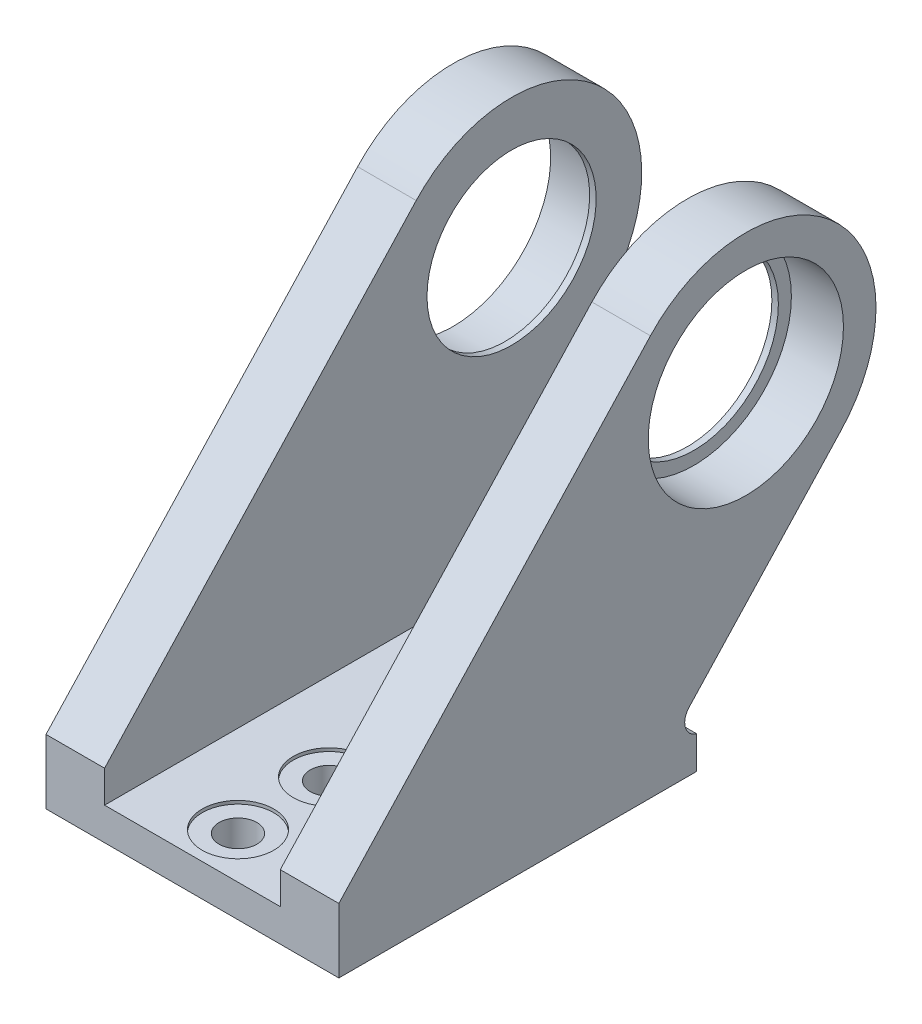
ISO-10303-21;
HEADER;
FILE_DESCRIPTION(('STEP AP214'),'2;1');
FILE_NAME('part.step','',(''),(''),'','','');
FILE_SCHEMA(('AUTOMOTIVE_DESIGN { 1 0 10303 214 1 1 1 1 }'));
ENDSEC;
DATA;
#1=APPLICATION_CONTEXT('core data for automotive mechanical design processes');
#2=APPLICATION_PROTOCOL_DEFINITION('international standard','automotive_design',2000,#1);
#3=PRODUCT_CONTEXT('',#1,'mechanical');
#4=PRODUCT('Part','Part','',(#3));
#5=PRODUCT_RELATED_PRODUCT_CATEGORY('part','',(#4));
#6=PRODUCT_DEFINITION_FORMATION('','',#4);
#7=PRODUCT_DEFINITION_CONTEXT('part definition',#1,'design');
#8=PRODUCT_DEFINITION('design','',#6,#7);
#9=PRODUCT_DEFINITION_SHAPE('','',#8);
#10=(LENGTH_UNIT() NAMED_UNIT(*) SI_UNIT(.MILLI.,.METRE.));
#11=(NAMED_UNIT(*) PLANE_ANGLE_UNIT() SI_UNIT($,.RADIAN.));
#12=(NAMED_UNIT(*) SI_UNIT($,.STERADIAN.) SOLID_ANGLE_UNIT());
#13=UNCERTAINTY_MEASURE_WITH_UNIT(LENGTH_MEASURE(1.E-05),#10,'distance_accuracy_value','');
#14=(GEOMETRIC_REPRESENTATION_CONTEXT(3) GLOBAL_UNCERTAINTY_ASSIGNED_CONTEXT((#13)) GLOBAL_UNIT_ASSIGNED_CONTEXT((#10,
#11,#12)) REPRESENTATION_CONTEXT('',''));
#15=CARTESIAN_POINT('',(0.,0.,0.));
#16=DIRECTION('',(0.,0.,1.));
#17=DIRECTION('',(1.,0.,0.));
#18=AXIS2_PLACEMENT_3D('',#15,#16,#17);
#19=CARTESIAN_POINT('',(36.,47.9257727599631,-62.5450401737106));
#20=DIRECTION('',(1.,0.,0.));
#21=DIRECTION('',(0.,0.,-1.));
#22=AXIS2_PLACEMENT_3D('',#19,#20,#21);
#23=CYLINDRICAL_SURFACE('',#22,13.);
#24=CARTESIAN_POINT('',(36.,47.9257727599631,-62.5450401737106));
#25=DIRECTION('',(1.,0.,0.));
#26=DIRECTION('',(0.,0.,-1.));
#27=AXIS2_PLACEMENT_3D('',#24,#25,#26);
#28=CIRCLE('',#27,13.);
#29=CARTESIAN_POINT('',(36.,47.9257727599631,-75.5450401737106));
#30=VERTEX_POINT('',#29);
#31=EDGE_CURVE('E178',#30,#30,#28,.T.);
#32=ORIENTED_EDGE('',*,*,#31,.F.);
#33=EDGE_LOOP('',(#32));
#34=FACE_BOUND('',#33,.T.);
#35=CARTESIAN_POINT('',(37.,47.9257727599631,-62.5450401737106));
#36=DIRECTION('',(1.,0.,0.));
#37=DIRECTION('',(0.,0.,-1.));
#38=AXIS2_PLACEMENT_3D('',#35,#36,#37);
#39=CIRCLE('',#38,13.);
#40=CARTESIAN_POINT('',(37.,47.9257727599631,-75.5450401737106));
#41=VERTEX_POINT('',#40);
#42=EDGE_CURVE('E44',#41,#41,#39,.F.);
#43=ORIENTED_EDGE('',*,*,#42,.F.);
#44=EDGE_LOOP('',(#43));
#45=FACE_BOUND('',#44,.T.);
#46=ADVANCED_FACE('F40',(#34,#45),#23,.F.);
#47=CARTESIAN_POINT('',(9.,47.9257727599631,-62.5450401737106));
#48=DIRECTION('',(-1.,0.,0.));
#49=DIRECTION('',(0.,0.,1.));
#50=AXIS2_PLACEMENT_3D('',#47,#48,#49);
#51=CYLINDRICAL_SURFACE('',#50,13.);
#52=CARTESIAN_POINT('',(9.,47.9257727599631,-62.5450401737106));
#53=DIRECTION('',(-1.,0.,0.));
#54=DIRECTION('',(0.,0.,1.));
#55=AXIS2_PLACEMENT_3D('',#52,#53,#54);
#56=CIRCLE('',#55,13.);
#57=CARTESIAN_POINT('',(9.,47.9257727599631,-49.5450401737106));
#58=VERTEX_POINT('',#57);
#59=EDGE_CURVE('E183',#58,#58,#56,.T.);
#60=ORIENTED_EDGE('',*,*,#59,.F.);
#61=EDGE_LOOP('',(#60));
#62=FACE_BOUND('',#61,.T.);
#63=CARTESIAN_POINT('',(8.,47.9257727599631,-62.5450401737106));
#64=DIRECTION('',(-1.,0.,0.));
#65=DIRECTION('',(0.,0.,1.));
#66=AXIS2_PLACEMENT_3D('',#63,#64,#65);
#67=CIRCLE('',#66,13.);
#68=CARTESIAN_POINT('',(8.,47.9257727599631,-49.5450401737106));
#69=VERTEX_POINT('',#68);
#70=EDGE_CURVE('E293',#69,#69,#67,.F.);
#71=ORIENTED_EDGE('',*,*,#70,.F.);
#72=EDGE_LOOP('',(#71));
#73=FACE_BOUND('',#72,.T.);
#74=ADVANCED_FACE('F374',(#62,#73),#51,.F.);
#75=CARTESIAN_POINT('',(0.,5.,0.));
#76=DIRECTION('',(0.,-1.,0.));
#77=DIRECTION('',(0.,0.,-1.));
#78=AXIS2_PLACEMENT_3D('',#75,#76,#77);
#79=PLANE('',#78);
#80=CARTESIAN_POINT('',(22.5,5.,-21.));
#81=DIRECTION('',(0.,1.,0.));
#82=DIRECTION('',(0.,0.,1.));
#83=AXIS2_PLACEMENT_3D('',#80,#81,#82);
#84=CIRCLE('',#83,5.49999999999999);
#85=CARTESIAN_POINT('',(22.5,5.,-15.5));
#86=VERTEX_POINT('',#85);
#87=EDGE_CURVE('E296',#86,#86,#84,.T.);
#88=ORIENTED_EDGE('',*,*,#87,.F.);
#89=EDGE_LOOP('',(#88));
#90=FACE_BOUND('',#89,.T.);
#91=CARTESIAN_POINT('',(22.5,5.,-7.));
#92=DIRECTION('',(0.,1.,0.));
#93=DIRECTION('',(0.,0.,1.));
#94=AXIS2_PLACEMENT_3D('',#91,#92,#93);
#95=CIRCLE('',#94,5.49999999999999);
#96=CARTESIAN_POINT('',(22.5,5.,-1.50000000000001));
#97=VERTEX_POINT('',#96);
#98=EDGE_CURVE('E328',#97,#97,#95,.T.);
#99=ORIENTED_EDGE('',*,*,#98,.F.);
#100=EDGE_LOOP('',(#99));
#101=FACE_BOUND('',#100,.T.);
#102=CARTESIAN_POINT('',(22.5,5.,-35.));
#103=DIRECTION('',(0.,1.,0.));
#104=DIRECTION('',(0.,0.,1.));
#105=AXIS2_PLACEMENT_3D('',#102,#103,#104);
#106=CIRCLE('',#105,5.49999999999999);
#107=CARTESIAN_POINT('',(22.5,5.,-29.5));
#108=VERTEX_POINT('',#107);
#109=EDGE_CURVE('E344',#108,#108,#106,.T.);
#110=ORIENTED_EDGE('',*,*,#109,.F.);
#111=EDGE_LOOP('',(#110));
#112=FACE_BOUND('',#111,.T.);
#113=DIRECTION('',(1.,0.,0.));
#114=VECTOR('',#113,1.);
#115=CARTESIAN_POINT('',(45.,5.,-55.));
#116=LINE('',#115,#114);
#117=CARTESIAN_POINT('',(9.00000000000001,5.,-55.));
#118=VERTEX_POINT('',#117);
#119=CARTESIAN_POINT('',(36.,5.,-55.));
#120=VERTEX_POINT('',#119);
#121=EDGE_CURVE('E179',#118,#120,#116,.T.);
#122=ORIENTED_EDGE('',*,*,#121,.F.);
#123=DIRECTION('',(0.,0.,-1.));
#124=VECTOR('',#123,1.);
#125=CARTESIAN_POINT('',(9.,5.,0.));
#126=LINE('',#125,#124);
#127=CARTESIAN_POINT('',(9.,5.,0.));
#128=VERTEX_POINT('',#127);
#129=EDGE_CURVE('E201',#128,#118,#126,.T.);
#130=ORIENTED_EDGE('',*,*,#129,.F.);
#131=DIRECTION('',(1.,0.,0.));
#132=VECTOR('',#131,1.);
#133=CARTESIAN_POINT('',(0.,5.,0.));
#134=LINE('',#133,#132);
#135=CARTESIAN_POINT('',(36.,5.,0.));
#136=VERTEX_POINT('',#135);
#137=EDGE_CURVE('E146',#128,#136,#134,.T.);
#138=ORIENTED_EDGE('',*,*,#137,.T.);
#139=DIRECTION('',(0.,0.,-1.));
#140=VECTOR('',#139,1.);
#141=CARTESIAN_POINT('',(36.,5.,-50.));
#142=LINE('',#141,#140);
#143=EDGE_CURVE('E229',#136,#120,#142,.T.);
#144=ORIENTED_EDGE('',*,*,#143,.T.);
#145=EDGE_LOOP('',(#122,#130,#138,#144));
#146=FACE_BOUND('',#145,.T.);
#147=ADVANCED_FACE('F370',(#90,#101,#112,#146),#79,.F.);
#148=CARTESIAN_POINT('',(0.,5.,0.));
#149=DIRECTION('',(1.,0.,0.));
#150=DIRECTION('',(0.,0.,-1.));
#151=AXIS2_PLACEMENT_3D('',#148,#149,#150);
#152=PLANE('',#151);
#153=CARTESIAN_POINT('',(0.,47.9257727599631,-62.5450401737106));
#154=DIRECTION('',(-1.,0.,0.));
#155=DIRECTION('',(0.,0.,1.));
#156=AXIS2_PLACEMENT_3D('',#153,#154,#155);
#157=CIRCLE('',#156,15.);
#158=CARTESIAN_POINT('',(0.,47.9257727599631,-47.5450401737106));
#159=VERTEX_POINT('',#158);
#160=EDGE_CURVE('E306',#159,#159,#157,.T.);
#161=ORIENTED_EDGE('',*,*,#160,.F.);
#162=EDGE_LOOP('',(#161));
#163=FACE_BOUND('',#162,.T.);
#164=DIRECTION('',(0.,0.,1.));
#165=VECTOR('',#164,1.);
#166=CARTESIAN_POINT('',(0.,0.,0.));
#167=LINE('',#166,#165);
#168=CARTESIAN_POINT('',(0.,0.,-55.));
#169=VERTEX_POINT('',#168);
#170=CARTESIAN_POINT('',(0.,0.,0.));
#171=VERTEX_POINT('',#170);
#172=EDGE_CURVE('E153',#169,#171,#167,.T.);
#173=ORIENTED_EDGE('',*,*,#172,.T.);
#174=DIRECTION('',(0.,-1.,0.));
#175=VECTOR('',#174,1.);
#176=CARTESIAN_POINT('',(0.,5.,0.));
#177=LINE('',#176,#175);
#178=CARTESIAN_POINT('',(0.,9.92054010056791,0.));
#179=VERTEX_POINT('',#178);
#180=EDGE_CURVE('E275',#179,#171,#177,.T.);
#181=ORIENTED_EDGE('',*,*,#180,.F.);
#182=DIRECTION('',(0.,0.733065053462156,-0.680158531073842));
#183=VECTOR('',#182,1.);
#184=CARTESIAN_POINT('',(0.,4.58939688269694,4.9463857578345));
#185=LINE('',#184,#183);
#186=CARTESIAN_POINT('',(0.,61.5289433814399,-47.8837391044675));
#187=VERTEX_POINT('',#186);
#188=EDGE_CURVE('E187',#179,#187,#185,.T.);
#189=ORIENTED_EDGE('',*,*,#188,.T.);
#190=CARTESIAN_POINT('',(0.,47.9257727599631,-62.5450401737106));
#191=DIRECTION('',(-1.,0.,0.));
#192=DIRECTION('',(0.,0.,1.));
#193=AXIS2_PLACEMENT_3D('',#190,#191,#192);
#194=CIRCLE('',#193,20.);
#195=CARTESIAN_POINT('',(0.,34.3226021384862,-77.2063412429537));
#196=VERTEX_POINT('',#195);
#197=EDGE_CURVE('E212',#187,#196,#194,.T.);
#198=ORIENTED_EDGE('',*,*,#197,.T.);
#199=DIRECTION('',(0.,-0.733065053462156,0.680158531073842));
#200=VECTOR('',#199,1.);
#201=CARTESIAN_POINT('',(0.,-22.6169443602567,-24.3762163806517));
#202=LINE('',#201,#200);
#203=CARTESIAN_POINT('',(0.,9.11438853861562,-53.8174462845763));
#204=VERTEX_POINT('',#203);
#205=EDGE_CURVE('E193',#196,#204,#202,.T.);
#206=ORIENTED_EDGE('',*,*,#205,.T.);
#207=CARTESIAN_POINT('',(0.,7.41399221093101,-55.6501089182317));
#208=DIRECTION('',(1.,0.,0.));
#209=DIRECTION('',(0.,0.,-1.));
#210=AXIS2_PLACEMENT_3D('',#207,#208,#209);
#211=CIRCLE('',#210,2.5);
#212=CARTESIAN_POINT('',(0.,5.,-55.));
#213=VERTEX_POINT('',#212);
#214=EDGE_CURVE('E286',#204,#213,#211,.T.);
#215=ORIENTED_EDGE('',*,*,#214,.T.);
#216=DIRECTION('',(0.,1.,0.));
#217=VECTOR('',#216,1.);
#218=CARTESIAN_POINT('',(0.,5.,-55.));
#219=LINE('',#218,#217);
#220=EDGE_CURVE('E158',#169,#213,#219,.T.);
#221=ORIENTED_EDGE('',*,*,#220,.F.);
#222=EDGE_LOOP('',(#173,#181,#189,#198,#206,#215,#221));
#223=FACE_BOUND('',#222,.T.);
#224=ADVANCED_FACE('F373',(#163,#223),#152,.F.);
#225=CARTESIAN_POINT('',(0.,5.,0.));
#226=DIRECTION('',(0.,0.,-1.));
#227=DIRECTION('',(-1.,0.,0.));
#228=AXIS2_PLACEMENT_3D('',#225,#226,#227);
#229=PLANE('',#228);
#230=DIRECTION('',(1.,0.,0.));
#231=VECTOR('',#230,1.);
#232=CARTESIAN_POINT('',(0.,0.,0.));
#233=LINE('',#232,#231);
#234=CARTESIAN_POINT('',(45.,0.,0.));
#235=VERTEX_POINT('',#234);
#236=EDGE_CURVE('E147',#171,#235,#233,.T.);
#237=ORIENTED_EDGE('',*,*,#236,.T.);
#238=DIRECTION('',(0.,-1.,0.));
#239=VECTOR('',#238,1.);
#240=CARTESIAN_POINT('',(45.,5.,0.));
#241=LINE('',#240,#239);
#242=CARTESIAN_POINT('',(45.,9.92054010056791,0.));
#243=VERTEX_POINT('',#242);
#244=EDGE_CURVE('E143',#243,#235,#241,.T.);
#245=ORIENTED_EDGE('',*,*,#244,.F.);
#246=DIRECTION('',(1.,0.,0.));
#247=VECTOR('',#246,1.);
#248=CARTESIAN_POINT('',(36.,9.92054010056791,0.));
#249=LINE('',#248,#247);
#250=CARTESIAN_POINT('',(36.,9.92054010056791,0.));
#251=VERTEX_POINT('',#250);
#252=EDGE_CURVE('E257',#251,#243,#249,.T.);
#253=ORIENTED_EDGE('',*,*,#252,.F.);
#254=DIRECTION('',(0.,-1.,0.));
#255=VECTOR('',#254,1.);
#256=CARTESIAN_POINT('',(36.,5.,0.));
#257=LINE('',#256,#255);
#258=EDGE_CURVE('E244',#251,#136,#257,.T.);
#259=ORIENTED_EDGE('',*,*,#258,.T.);
#260=ORIENTED_EDGE('',*,*,#137,.F.);
#261=DIRECTION('',(0.,1.,0.));
#262=VECTOR('',#261,1.);
#263=CARTESIAN_POINT('',(9.,0.,0.));
#264=LINE('',#263,#262);
#265=CARTESIAN_POINT('',(9.,9.92054010056791,0.));
#266=VERTEX_POINT('',#265);
#267=EDGE_CURVE('E204',#128,#266,#264,.T.);
#268=ORIENTED_EDGE('',*,*,#267,.T.);
#269=DIRECTION('',(-1.,0.,0.));
#270=VECTOR('',#269,1.);
#271=CARTESIAN_POINT('',(9.,9.92054010056791,0.));
#272=LINE('',#271,#270);
#273=EDGE_CURVE('E219',#266,#179,#272,.T.);
#274=ORIENTED_EDGE('',*,*,#273,.T.);
#275=ORIENTED_EDGE('',*,*,#180,.T.);
#276=EDGE_LOOP('',(#237,#245,#253,#259,#260,#268,#274,#275));
#277=FACE_BOUND('',#276,.T.);
#278=ADVANCED_FACE('F402',(#277),#229,.F.);
#279=CARTESIAN_POINT('',(45.,5.,0.));
#280=DIRECTION('',(-1.,0.,0.));
#281=DIRECTION('',(0.,0.,1.));
#282=AXIS2_PLACEMENT_3D('',#279,#280,#281);
#283=PLANE('',#282);
#284=CARTESIAN_POINT('',(45.,47.9257727599631,-62.5450401737106));
#285=DIRECTION('',(1.,0.,0.));
#286=DIRECTION('',(0.,0.,-1.));
#287=AXIS2_PLACEMENT_3D('',#284,#285,#286);
#288=CIRCLE('',#287,15.);
#289=CARTESIAN_POINT('',(45.,47.9257727599631,-77.5450401737106));
#290=VERTEX_POINT('',#289);
#291=EDGE_CURVE('E314',#290,#290,#288,.T.);
#292=ORIENTED_EDGE('',*,*,#291,.F.);
#293=EDGE_LOOP('',(#292));
#294=FACE_BOUND('',#293,.T.);
#295=DIRECTION('',(0.,0.,-1.));
#296=VECTOR('',#295,1.);
#297=CARTESIAN_POINT('',(45.,0.,0.));
#298=LINE('',#297,#296);
#299=CARTESIAN_POINT('',(45.,0.,-55.));
#300=VERTEX_POINT('',#299);
#301=EDGE_CURVE('E137',#235,#300,#298,.T.);
#302=ORIENTED_EDGE('',*,*,#301,.T.);
#303=DIRECTION('',(0.,-1.,0.));
#304=VECTOR('',#303,1.);
#305=CARTESIAN_POINT('',(45.,5.,-55.));
#306=LINE('',#305,#304);
#307=CARTESIAN_POINT('',(45.,5.,-55.));
#308=VERTEX_POINT('',#307);
#309=EDGE_CURVE('E141',#308,#300,#306,.T.);
#310=ORIENTED_EDGE('',*,*,#309,.F.);
#311=CARTESIAN_POINT('',(45.,7.41399221093101,-55.6501089182317));
#312=DIRECTION('',(-1.,0.,0.));
#313=DIRECTION('',(0.,0.,1.));
#314=AXIS2_PLACEMENT_3D('',#311,#312,#313);
#315=CIRCLE('',#314,2.5);
#316=CARTESIAN_POINT('',(45.,9.11438853861562,-53.8174462845763));
#317=VERTEX_POINT('',#316);
#318=EDGE_CURVE('E11',#308,#317,#315,.T.);
#319=ORIENTED_EDGE('',*,*,#318,.T.);
#320=DIRECTION('',(0.,0.733065053462156,-0.680158531073842));
#321=VECTOR('',#320,1.);
#322=CARTESIAN_POINT('',(45.,34.3226021384862,-77.2063412429537));
#323=LINE('',#322,#321);
#324=CARTESIAN_POINT('',(45.,34.3226021384862,-77.2063412429537));
#325=VERTEX_POINT('',#324);
#326=EDGE_CURVE('E223',#317,#325,#323,.T.);
#327=ORIENTED_EDGE('',*,*,#326,.T.);
#328=CARTESIAN_POINT('',(45.,47.9257727599631,-62.5450401737106));
#329=DIRECTION('',(1.,0.,0.));
#330=DIRECTION('',(0.,0.,-1.));
#331=AXIS2_PLACEMENT_3D('',#328,#329,#330);
#332=CIRCLE('',#331,20.);
#333=CARTESIAN_POINT('',(45.,61.5289433814399,-47.8837391044675));
#334=VERTEX_POINT('',#333);
#335=EDGE_CURVE('E251',#325,#334,#332,.T.);
#336=ORIENTED_EDGE('',*,*,#335,.T.);
#337=DIRECTION('',(0.,-0.733065053462156,0.680158531073842));
#338=VECTOR('',#337,1.);
#339=CARTESIAN_POINT('',(45.,9.92054010056791,0.));
#340=LINE('',#339,#338);
#341=EDGE_CURVE('E233',#334,#243,#340,.T.);
#342=ORIENTED_EDGE('',*,*,#341,.T.);
#343=ORIENTED_EDGE('',*,*,#244,.T.);
#344=EDGE_LOOP('',(#302,#310,#319,#327,#336,#342,#343));
#345=FACE_BOUND('',#344,.T.);
#346=ADVANCED_FACE('F139',(#294,#345),#283,.F.);
#347=CARTESIAN_POINT('',(0.,0.,0.));
#348=DIRECTION('',(0.,-1.,0.));
#349=DIRECTION('',(0.,0.,-1.));
#350=AXIS2_PLACEMENT_3D('',#347,#348,#349);
#351=PLANE('',#350);
#352=CARTESIAN_POINT('',(22.5,0.,-21.));
#353=DIRECTION('',(0.,1.,0.));
#354=DIRECTION('',(0.,0.,1.));
#355=AXIS2_PLACEMENT_3D('',#352,#353,#354);
#356=CIRCLE('',#355,2.9);
#357=CARTESIAN_POINT('',(22.5,0.,-18.1));
#358=VERTEX_POINT('',#357);
#359=EDGE_CURVE('E324',#358,#358,#356,.T.);
#360=ORIENTED_EDGE('',*,*,#359,.T.);
#361=EDGE_LOOP('',(#360));
#362=FACE_BOUND('',#361,.T.);
#363=CARTESIAN_POINT('',(22.5,0.,-7.));
#364=DIRECTION('',(0.,1.,0.));
#365=DIRECTION('',(0.,0.,1.));
#366=AXIS2_PLACEMENT_3D('',#363,#364,#365);
#367=CIRCLE('',#366,2.9);
#368=CARTESIAN_POINT('',(22.5,0.,-4.1));
#369=VERTEX_POINT('',#368);
#370=EDGE_CURVE('E340',#369,#369,#367,.T.);
#371=ORIENTED_EDGE('',*,*,#370,.T.);
#372=EDGE_LOOP('',(#371));
#373=FACE_BOUND('',#372,.T.);
#374=CARTESIAN_POINT('',(22.5,0.,-35.));
#375=DIRECTION('',(0.,1.,0.));
#376=DIRECTION('',(0.,0.,1.));
#377=AXIS2_PLACEMENT_3D('',#374,#375,#376);
#378=CIRCLE('',#377,2.9);
#379=CARTESIAN_POINT('',(22.5,0.,-32.1));
#380=VERTEX_POINT('',#379);
#381=EDGE_CURVE('E164',#380,#380,#378,.T.);
#382=ORIENTED_EDGE('',*,*,#381,.T.);
#383=EDGE_LOOP('',(#382));
#384=FACE_BOUND('',#383,.T.);
#385=ORIENTED_EDGE('',*,*,#172,.F.);
#386=DIRECTION('',(-1.,0.,0.));
#387=VECTOR('',#386,1.);
#388=CARTESIAN_POINT('',(45.,0.,-55.));
#389=LINE('',#388,#387);
#390=EDGE_CURVE('E150',#300,#169,#389,.T.);
#391=ORIENTED_EDGE('',*,*,#390,.F.);
#392=ORIENTED_EDGE('',*,*,#301,.F.);
#393=ORIENTED_EDGE('',*,*,#236,.F.);
#394=EDGE_LOOP('',(#385,#391,#392,#393));
#395=FACE_BOUND('',#394,.T.);
#396=ADVANCED_FACE('F151',(#362,#373,#384,#395),#351,.T.);
#397=CARTESIAN_POINT('',(36.,9.92054010056791,0.));
#398=DIRECTION('',(0.,0.680158531073842,0.733065053462156));
#399=DIRECTION('',(0.,-0.733065053462156,0.680158531073842));
#400=AXIS2_PLACEMENT_3D('',#397,#398,#399);
#401=PLANE('',#400);
#402=ORIENTED_EDGE('',*,*,#341,.F.);
#403=DIRECTION('',(1.,0.,0.));
#404=VECTOR('',#403,1.);
#405=CARTESIAN_POINT('',(36.,61.5289433814399,-47.8837391044675));
#406=LINE('',#405,#404);
#407=CARTESIAN_POINT('',(36.,61.5289433814399,-47.8837391044675));
#408=VERTEX_POINT('',#407);
#409=EDGE_CURVE('E261',#408,#334,#406,.T.);
#410=ORIENTED_EDGE('',*,*,#409,.F.);
#411=DIRECTION('',(0.,-0.733065053462156,0.680158531073842));
#412=VECTOR('',#411,1.);
#413=CARTESIAN_POINT('',(36.,9.92054010056791,0.));
#414=LINE('',#413,#412);
#415=EDGE_CURVE('E240',#408,#251,#414,.T.);
#416=ORIENTED_EDGE('',*,*,#415,.T.);
#417=ORIENTED_EDGE('',*,*,#252,.T.);
#418=EDGE_LOOP('',(#402,#410,#416,#417));
#419=FACE_BOUND('',#418,.T.);
#420=ADVANCED_FACE('F451',(#419),#401,.T.);
#421=CARTESIAN_POINT('',(36.,47.9257727599631,-62.5450401737106));
#422=DIRECTION('',(1.,0.,0.));
#423=DIRECTION('',(0.,0.,-1.));
#424=AXIS2_PLACEMENT_3D('',#421,#422,#423);
#425=CYLINDRICAL_SURFACE('',#424,20.);
#426=ORIENTED_EDGE('',*,*,#335,.F.);
#427=DIRECTION('',(1.,0.,0.));
#428=VECTOR('',#427,1.);
#429=CARTESIAN_POINT('',(36.,34.3226021384862,-77.2063412429537));
#430=LINE('',#429,#428);
#431=CARTESIAN_POINT('',(36.,34.3226021384862,-77.2063412429537));
#432=VERTEX_POINT('',#431);
#433=EDGE_CURVE('E248',#432,#325,#430,.T.);
#434=ORIENTED_EDGE('',*,*,#433,.F.);
#435=CARTESIAN_POINT('',(36.,47.9257727599631,-62.5450401737106));
#436=DIRECTION('',(1.,0.,0.));
#437=DIRECTION('',(0.,0.,-1.));
#438=AXIS2_PLACEMENT_3D('',#435,#436,#437);
#439=CIRCLE('',#438,20.);
#440=EDGE_CURVE('E236',#432,#408,#439,.T.);
#441=ORIENTED_EDGE('',*,*,#440,.T.);
#442=ORIENTED_EDGE('',*,*,#409,.T.);
#443=EDGE_LOOP('',(#426,#434,#441,#442));
#444=FACE_BOUND('',#443,.T.);
#445=ADVANCED_FACE('F414',(#444),#425,.T.);
#446=CARTESIAN_POINT('',(36.,34.3226021384862,-77.2063412429537));
#447=DIRECTION('',(0.,-0.680158531073842,-0.733065053462155));
#448=DIRECTION('',(0.,0.733065053462156,-0.680158531073842));
#449=AXIS2_PLACEMENT_3D('',#446,#447,#448);
#450=PLANE('',#449);
#451=ORIENTED_EDGE('',*,*,#326,.F.);
#452=DIRECTION('',(-1.,0.,0.));
#453=VECTOR('',#452,1.);
#454=CARTESIAN_POINT('',(36.,9.11438853861562,-53.8174462845763));
#455=LINE('',#454,#453);
#456=CARTESIAN_POINT('',(36.,9.11438853861562,-53.8174462845763));
#457=VERTEX_POINT('',#456);
#458=EDGE_CURVE('E283',#317,#457,#455,.T.);
#459=ORIENTED_EDGE('',*,*,#458,.T.);
#460=DIRECTION('',(0.,0.733065053462156,-0.680158531073842));
#461=VECTOR('',#460,1.);
#462=CARTESIAN_POINT('',(36.,34.3226021384862,-77.2063412429537));
#463=LINE('',#462,#461);
#464=EDGE_CURVE('E232',#457,#432,#463,.T.);
#465=ORIENTED_EDGE('',*,*,#464,.T.);
#466=ORIENTED_EDGE('',*,*,#433,.T.);
#467=EDGE_LOOP('',(#451,#459,#465,#466));
#468=FACE_BOUND('',#467,.T.);
#469=ADVANCED_FACE('F411',(#468),#450,.T.);
#470=CARTESIAN_POINT('',(36.,47.9257727599631,-62.5450401737106));
#471=DIRECTION('',(1.,0.,0.));
#472=DIRECTION('',(0.,0.,-1.));
#473=AXIS2_PLACEMENT_3D('',#470,#471,#472);
#474=PLANE('',#473);
#475=ORIENTED_EDGE('',*,*,#31,.T.);
#476=EDGE_LOOP('',(#475));
#477=FACE_BOUND('',#476,.T.);
#478=ORIENTED_EDGE('',*,*,#143,.F.);
#479=ORIENTED_EDGE('',*,*,#258,.F.);
#480=ORIENTED_EDGE('',*,*,#415,.F.);
#481=ORIENTED_EDGE('',*,*,#440,.F.);
#482=ORIENTED_EDGE('',*,*,#464,.F.);
#483=CARTESIAN_POINT('',(36.,7.41399221093101,-55.6501089182317));
#484=DIRECTION('',(1.,0.,0.));
#485=DIRECTION('',(0.,0.,-1.));
#486=AXIS2_PLACEMENT_3D('',#483,#484,#485);
#487=CIRCLE('',#486,2.5);
#488=EDGE_CURVE('E50',#457,#120,#487,.T.);
#489=ORIENTED_EDGE('',*,*,#488,.T.);
#490=EDGE_LOOP('',(#478,#479,#480,#481,#482,#489));
#491=FACE_BOUND('',#490,.T.);
#492=ADVANCED_FACE('F405',(#477,#491),#474,.F.);
#493=CARTESIAN_POINT('',(9.,4.58939688269694,4.9463857578345));
#494=DIRECTION('',(0.,0.680158531073842,0.733065053462156));
#495=DIRECTION('',(0.,-0.733065053462156,0.680158531073842));
#496=AXIS2_PLACEMENT_3D('',#493,#494,#495);
#497=PLANE('',#496);
#498=ORIENTED_EDGE('',*,*,#188,.F.);
#499=ORIENTED_EDGE('',*,*,#273,.F.);
#500=DIRECTION('',(0.,0.733065053462156,-0.680158531073842));
#501=VECTOR('',#500,1.);
#502=CARTESIAN_POINT('',(9.,4.58939688269694,4.9463857578345));
#503=LINE('',#502,#501);
#504=CARTESIAN_POINT('',(9.,61.5289433814399,-47.8837391044675));
#505=VERTEX_POINT('',#504);
#506=EDGE_CURVE('E188',#266,#505,#503,.T.);
#507=ORIENTED_EDGE('',*,*,#506,.T.);
#508=DIRECTION('',(-1.,0.,0.));
#509=VECTOR('',#508,1.);
#510=CARTESIAN_POINT('',(9.,61.5289433814399,-47.8837391044675));
#511=LINE('',#510,#509);
#512=EDGE_CURVE('E208',#505,#187,#511,.T.);
#513=ORIENTED_EDGE('',*,*,#512,.T.);
#514=EDGE_LOOP('',(#498,#499,#507,#513));
#515=FACE_BOUND('',#514,.T.);
#516=ADVANCED_FACE('F400',(#515),#497,.T.);
#517=CARTESIAN_POINT('',(9.,-22.6169443602567,-24.3762163806517));
#518=DIRECTION('',(0.,-0.680158531073842,-0.733065053462156));
#519=DIRECTION('',(0.,0.733065053462156,-0.680158531073842));
#520=AXIS2_PLACEMENT_3D('',#517,#518,#519);
#521=PLANE('',#520);
#522=DIRECTION('',(0.,-0.733065053462156,0.680158531073842));
#523=VECTOR('',#522,1.);
#524=CARTESIAN_POINT('',(9.,-22.6169443602567,-24.3762163806517));
#525=LINE('',#524,#523);
#526=CARTESIAN_POINT('',(9.,34.3226021384862,-77.2063412429537));
#527=VERTEX_POINT('',#526);
#528=CARTESIAN_POINT('',(9.,9.11438853861562,-53.8174462845763));
#529=VERTEX_POINT('',#528);
#530=EDGE_CURVE('E197',#527,#529,#525,.T.);
#531=ORIENTED_EDGE('',*,*,#530,.T.);
#532=DIRECTION('',(-1.,0.,0.));
#533=VECTOR('',#532,1.);
#534=CARTESIAN_POINT('',(0.,9.11438853861561,-53.8174462845763));
#535=LINE('',#534,#533);
#536=EDGE_CURVE('E279',#529,#204,#535,.T.);
#537=ORIENTED_EDGE('',*,*,#536,.T.);
#538=ORIENTED_EDGE('',*,*,#205,.F.);
#539=DIRECTION('',(-1.,0.,0.));
#540=VECTOR('',#539,1.);
#541=CARTESIAN_POINT('',(9.,34.3226021384862,-77.2063412429537));
#542=LINE('',#541,#540);
#543=EDGE_CURVE('E224',#527,#196,#542,.T.);
#544=ORIENTED_EDGE('',*,*,#543,.F.);
#545=EDGE_LOOP('',(#531,#537,#538,#544));
#546=FACE_BOUND('',#545,.T.);
#547=ADVANCED_FACE('F393',(#546),#521,.T.);
#548=CARTESIAN_POINT('',(9.,47.9257727599631,-62.5450401737106));
#549=DIRECTION('',(-1.,0.,0.));
#550=DIRECTION('',(0.,0.,1.));
#551=AXIS2_PLACEMENT_3D('',#548,#549,#550);
#552=CYLINDRICAL_SURFACE('',#551,20.);
#553=ORIENTED_EDGE('',*,*,#197,.F.);
#554=ORIENTED_EDGE('',*,*,#512,.F.);
#555=CARTESIAN_POINT('',(9.,47.9257727599631,-62.5450401737106));
#556=DIRECTION('',(-1.,0.,0.));
#557=DIRECTION('',(0.,0.,1.));
#558=AXIS2_PLACEMENT_3D('',#555,#556,#557);
#559=CIRCLE('',#558,20.);
#560=EDGE_CURVE('E192',#505,#527,#559,.T.);
#561=ORIENTED_EDGE('',*,*,#560,.T.);
#562=ORIENTED_EDGE('',*,*,#543,.T.);
#563=EDGE_LOOP('',(#553,#554,#561,#562));
#564=FACE_BOUND('',#563,.T.);
#565=ADVANCED_FACE('F397',(#564),#552,.T.);
#566=CARTESIAN_POINT('',(9.,0.,0.));
#567=DIRECTION('',(-1.,0.,0.));
#568=DIRECTION('',(0.,0.,1.));
#569=AXIS2_PLACEMENT_3D('',#566,#567,#568);
#570=PLANE('',#569);
#571=ORIENTED_EDGE('',*,*,#59,.T.);
#572=EDGE_LOOP('',(#571));
#573=FACE_BOUND('',#572,.T.);
#574=ORIENTED_EDGE('',*,*,#506,.F.);
#575=ORIENTED_EDGE('',*,*,#267,.F.);
#576=ORIENTED_EDGE('',*,*,#129,.T.);
#577=CARTESIAN_POINT('',(9.,7.41399221093101,-55.6501089182317));
#578=DIRECTION('',(-1.,0.,0.));
#579=DIRECTION('',(0.,0.,1.));
#580=AXIS2_PLACEMENT_3D('',#577,#578,#579);
#581=CIRCLE('',#580,2.5);
#582=EDGE_CURVE('E289',#118,#529,#581,.T.);
#583=ORIENTED_EDGE('',*,*,#582,.T.);
#584=ORIENTED_EDGE('',*,*,#530,.F.);
#585=ORIENTED_EDGE('',*,*,#560,.F.);
#586=EDGE_LOOP('',(#574,#575,#576,#583,#584,#585));
#587=FACE_BOUND('',#586,.T.);
#588=ADVANCED_FACE('F389',(#573,#587),#570,.F.);
#589=CARTESIAN_POINT('',(0.,0.,-55.));
#590=DIRECTION('',(0.,0.,-1.));
#591=DIRECTION('',(-1.,0.,0.));
#592=AXIS2_PLACEMENT_3D('',#589,#590,#591);
#593=PLANE('',#592);
#594=ORIENTED_EDGE('',*,*,#309,.T.);
#595=ORIENTED_EDGE('',*,*,#390,.T.);
#596=ORIENTED_EDGE('',*,*,#220,.T.);
#597=EDGE_CURVE('E174',#213,#118,#116,.T.);
#598=ORIENTED_EDGE('',*,*,#597,.T.);
#599=ORIENTED_EDGE('',*,*,#121,.T.);
#600=EDGE_CURVE('E162',#120,#308,#116,.T.);
#601=ORIENTED_EDGE('',*,*,#600,.T.);
#602=EDGE_LOOP('',(#594,#595,#596,#598,#599,#601));
#603=FACE_BOUND('',#602,.T.);
#604=ADVANCED_FACE('F160',(#603),#593,.T.);
#605=CARTESIAN_POINT('',(0.,7.41399221093101,-55.6501089182317));
#606=DIRECTION('',(1.,0.,0.));
#607=DIRECTION('',(0.,0.,-1.));
#608=AXIS2_PLACEMENT_3D('',#605,#606,#607);
#609=CYLINDRICAL_SURFACE('',#608,2.5);
#610=ORIENTED_EDGE('',*,*,#582,.F.);
#611=ORIENTED_EDGE('',*,*,#597,.F.);
#612=ORIENTED_EDGE('',*,*,#214,.F.);
#613=ORIENTED_EDGE('',*,*,#536,.F.);
#614=EDGE_LOOP('',(#610,#611,#612,#613));
#615=FACE_BOUND('',#614,.T.);
#616=ADVANCED_FACE('F385',(#615),#609,.F.);
#617=CARTESIAN_POINT('',(0.,7.41399221093101,-55.6501089182317));
#618=DIRECTION('',(1.,0.,0.));
#619=DIRECTION('',(0.,0.,-1.));
#620=AXIS2_PLACEMENT_3D('',#617,#618,#619);
#621=CYLINDRICAL_SURFACE('',#620,2.5);
#622=ORIENTED_EDGE('',*,*,#318,.F.);
#623=ORIENTED_EDGE('',*,*,#600,.F.);
#624=ORIENTED_EDGE('',*,*,#488,.F.);
#625=ORIENTED_EDGE('',*,*,#458,.F.);
#626=EDGE_LOOP('',(#622,#623,#624,#625));
#627=FACE_BOUND('',#626,.T.);
#628=ADVANCED_FACE('F42',(#627),#621,.F.);
#629=CARTESIAN_POINT('',(22.5,5.,-35.));
#630=DIRECTION('',(0.,1.,0.));
#631=DIRECTION('',(0.,0.,1.));
#632=AXIS2_PLACEMENT_3D('',#629,#630,#631);
#633=CYLINDRICAL_SURFACE('',#632,2.9);
#634=ORIENTED_EDGE('',*,*,#381,.F.);
#635=EDGE_LOOP('',(#634));
#636=FACE_BOUND('',#635,.T.);
#637=CARTESIAN_POINT('',(22.5,4.5,-35.));
#638=DIRECTION('',(0.,1.,0.));
#639=DIRECTION('',(0.,0.,1.));
#640=AXIS2_PLACEMENT_3D('',#637,#638,#639);
#641=CIRCLE('',#640,2.9);
#642=CARTESIAN_POINT('',(22.5,4.5,-32.1));
#643=VERTEX_POINT('',#642);
#644=EDGE_CURVE('E168',#643,#643,#641,.T.);
#645=ORIENTED_EDGE('',*,*,#644,.T.);
#646=EDGE_LOOP('',(#645));
#647=FACE_BOUND('',#646,.T.);
#648=ADVANCED_FACE('F355',(#636,#647),#633,.F.);
#649=CARTESIAN_POINT('',(25.4,4.5,-35.));
#650=DIRECTION('',(0.,-1.,0.));
#651=DIRECTION('',(0.,0.,-1.));
#652=AXIS2_PLACEMENT_3D('',#649,#650,#651);
#653=PLANE('',#652);
#654=ORIENTED_EDGE('',*,*,#644,.F.);
#655=EDGE_LOOP('',(#654));
#656=FACE_BOUND('',#655,.T.);
#657=CARTESIAN_POINT('',(22.5,4.5,-35.));
#658=DIRECTION('',(0.,1.,0.));
#659=DIRECTION('',(0.,0.,1.));
#660=AXIS2_PLACEMENT_3D('',#657,#658,#659);
#661=CIRCLE('',#660,5.5);
#662=CARTESIAN_POINT('',(22.5,4.5,-29.5));
#663=VERTEX_POINT('',#662);
#664=EDGE_CURVE('E348',#663,#663,#661,.T.);
#665=ORIENTED_EDGE('',*,*,#664,.T.);
#666=EDGE_LOOP('',(#665));
#667=FACE_BOUND('',#666,.T.);
#668=ADVANCED_FACE('F357',(#656,#667),#653,.F.);
#669=CARTESIAN_POINT('',(22.5,5.,-35.));
#670=DIRECTION('',(0.,1.,0.));
#671=DIRECTION('',(0.,0.,1.));
#672=AXIS2_PLACEMENT_3D('',#669,#670,#671);
#673=CYLINDRICAL_SURFACE('',#672,5.5);
#674=ORIENTED_EDGE('',*,*,#664,.F.);
#675=EDGE_LOOP('',(#674));
#676=FACE_BOUND('',#675,.T.);
#677=ORIENTED_EDGE('',*,*,#109,.T.);
#678=EDGE_LOOP('',(#677));
#679=FACE_BOUND('',#678,.T.);
#680=ADVANCED_FACE('F360',(#676,#679),#673,.F.);
#681=CARTESIAN_POINT('',(22.5,5.,-7.));
#682=DIRECTION('',(0.,1.,0.));
#683=DIRECTION('',(0.,0.,1.));
#684=AXIS2_PLACEMENT_3D('',#681,#682,#683);
#685=CYLINDRICAL_SURFACE('',#684,2.9);
#686=ORIENTED_EDGE('',*,*,#370,.F.);
#687=EDGE_LOOP('',(#686));
#688=FACE_BOUND('',#687,.T.);
#689=CARTESIAN_POINT('',(22.5,4.5,-7.));
#690=DIRECTION('',(0.,1.,0.));
#691=DIRECTION('',(0.,0.,1.));
#692=AXIS2_PLACEMENT_3D('',#689,#690,#691);
#693=CIRCLE('',#692,2.9);
#694=CARTESIAN_POINT('',(22.5,4.5,-4.1));
#695=VERTEX_POINT('',#694);
#696=EDGE_CURVE('E336',#695,#695,#693,.T.);
#697=ORIENTED_EDGE('',*,*,#696,.T.);
#698=EDGE_LOOP('',(#697));
#699=FACE_BOUND('',#698,.T.);
#700=ADVANCED_FACE('F366',(#688,#699),#685,.F.);
#701=CARTESIAN_POINT('',(25.4,4.5,-7.));
#702=DIRECTION('',(0.,-1.,0.));
#703=DIRECTION('',(0.,0.,-1.));
#704=AXIS2_PLACEMENT_3D('',#701,#702,#703);
#705=PLANE('',#704);
#706=ORIENTED_EDGE('',*,*,#696,.F.);
#707=EDGE_LOOP('',(#706));
#708=FACE_BOUND('',#707,.T.);
#709=CARTESIAN_POINT('',(22.5,4.5,-7.));
#710=DIRECTION('',(0.,1.,0.));
#711=DIRECTION('',(0.,0.,1.));
#712=AXIS2_PLACEMENT_3D('',#709,#710,#711);
#713=CIRCLE('',#712,5.5);
#714=CARTESIAN_POINT('',(22.5,4.5,-1.5));
#715=VERTEX_POINT('',#714);
#716=EDGE_CURVE('E332',#715,#715,#713,.T.);
#717=ORIENTED_EDGE('',*,*,#716,.T.);
#718=EDGE_LOOP('',(#717));
#719=FACE_BOUND('',#718,.T.);
#720=ADVANCED_FACE('F504',(#708,#719),#705,.F.);
#721=CARTESIAN_POINT('',(22.5,5.,-7.));
#722=DIRECTION('',(0.,1.,0.));
#723=DIRECTION('',(0.,0.,1.));
#724=AXIS2_PLACEMENT_3D('',#721,#722,#723);
#725=CYLINDRICAL_SURFACE('',#724,5.5);
#726=ORIENTED_EDGE('',*,*,#716,.F.);
#727=EDGE_LOOP('',(#726));
#728=FACE_BOUND('',#727,.T.);
#729=ORIENTED_EDGE('',*,*,#98,.T.);
#730=EDGE_LOOP('',(#729));
#731=FACE_BOUND('',#730,.T.);
#732=ADVANCED_FACE('F500',(#728,#731),#725,.F.);
#733=CARTESIAN_POINT('',(22.5,5.,-21.));
#734=DIRECTION('',(0.,1.,0.));
#735=DIRECTION('',(0.,0.,1.));
#736=AXIS2_PLACEMENT_3D('',#733,#734,#735);
#737=CYLINDRICAL_SURFACE('',#736,2.9);
#738=ORIENTED_EDGE('',*,*,#359,.F.);
#739=EDGE_LOOP('',(#738));
#740=FACE_BOUND('',#739,.T.);
#741=CARTESIAN_POINT('',(22.5,4.5,-21.));
#742=DIRECTION('',(0.,1.,0.));
#743=DIRECTION('',(0.,0.,1.));
#744=AXIS2_PLACEMENT_3D('',#741,#742,#743);
#745=CIRCLE('',#744,2.9);
#746=CARTESIAN_POINT('',(22.5,4.5,-18.1));
#747=VERTEX_POINT('',#746);
#748=EDGE_CURVE('E320',#747,#747,#745,.T.);
#749=ORIENTED_EDGE('',*,*,#748,.T.);
#750=EDGE_LOOP('',(#749));
#751=FACE_BOUND('',#750,.T.);
#752=ADVANCED_FACE('F496',(#740,#751),#737,.F.);
#753=CARTESIAN_POINT('',(25.4,4.5,-21.));
#754=DIRECTION('',(0.,-1.,0.));
#755=DIRECTION('',(0.,0.,-1.));
#756=AXIS2_PLACEMENT_3D('',#753,#754,#755);
#757=PLANE('',#756);
#758=ORIENTED_EDGE('',*,*,#748,.F.);
#759=EDGE_LOOP('',(#758));
#760=FACE_BOUND('',#759,.T.);
#761=CARTESIAN_POINT('',(22.5,4.5,-21.));
#762=DIRECTION('',(0.,1.,0.));
#763=DIRECTION('',(0.,0.,1.));
#764=AXIS2_PLACEMENT_3D('',#761,#762,#763);
#765=CIRCLE('',#764,5.5);
#766=CARTESIAN_POINT('',(22.5,4.5,-15.5));
#767=VERTEX_POINT('',#766);
#768=EDGE_CURVE('E303',#767,#767,#765,.T.);
#769=ORIENTED_EDGE('',*,*,#768,.T.);
#770=EDGE_LOOP('',(#769));
#771=FACE_BOUND('',#770,.T.);
#772=ADVANCED_FACE('F492',(#760,#771),#757,.F.);
#773=CARTESIAN_POINT('',(22.5,5.,-21.));
#774=DIRECTION('',(0.,1.,0.));
#775=DIRECTION('',(0.,0.,1.));
#776=AXIS2_PLACEMENT_3D('',#773,#774,#775);
#777=CYLINDRICAL_SURFACE('',#776,5.5);
#778=ORIENTED_EDGE('',*,*,#768,.F.);
#779=EDGE_LOOP('',(#778));
#780=FACE_BOUND('',#779,.T.);
#781=ORIENTED_EDGE('',*,*,#87,.T.);
#782=EDGE_LOOP('',(#781));
#783=FACE_BOUND('',#782,.T.);
#784=ADVANCED_FACE('F486',(#780,#783),#777,.F.);
#785=CARTESIAN_POINT('',(8.,47.9257727599631,-62.5450401737106));
#786=DIRECTION('',(-1.,0.,0.));
#787=DIRECTION('',(0.,0.,1.));
#788=AXIS2_PLACEMENT_3D('',#785,#786,#787);
#789=PLANE('',#788);
#790=CARTESIAN_POINT('',(8.,47.9257727599631,-62.5450401737106));
#791=DIRECTION('',(-1.,0.,0.));
#792=DIRECTION('',(0.,0.,1.));
#793=AXIS2_PLACEMENT_3D('',#790,#791,#792);
#794=CIRCLE('',#793,15.);
#795=CARTESIAN_POINT('',(8.,47.9257727599631,-47.5450401737106));
#796=VERTEX_POINT('',#795);
#797=EDGE_CURVE('E297',#796,#796,#794,.T.);
#798=ORIENTED_EDGE('',*,*,#797,.T.);
#799=EDGE_LOOP('',(#798));
#800=FACE_BOUND('',#799,.T.);
#801=ORIENTED_EDGE('',*,*,#70,.T.);
#802=EDGE_LOOP('',(#801));
#803=FACE_BOUND('',#802,.T.);
#804=ADVANCED_FACE('F477',(#800,#803),#789,.T.);
#805=CARTESIAN_POINT('',(8.,47.9257727599631,-62.5450401737106));
#806=DIRECTION('',(-1.,0.,0.));
#807=DIRECTION('',(0.,0.,1.));
#808=AXIS2_PLACEMENT_3D('',#805,#806,#807);
#809=CYLINDRICAL_SURFACE('',#808,15.);
#810=ORIENTED_EDGE('',*,*,#797,.F.);
#811=EDGE_LOOP('',(#810));
#812=FACE_BOUND('',#811,.T.);
#813=ORIENTED_EDGE('',*,*,#160,.T.);
#814=EDGE_LOOP('',(#813));
#815=FACE_BOUND('',#814,.T.);
#816=ADVANCED_FACE('F474',(#812,#815),#809,.F.);
#817=CARTESIAN_POINT('',(37.,47.9257727599631,-62.5450401737106));
#818=DIRECTION('',(1.,0.,0.));
#819=DIRECTION('',(0.,0.,-1.));
#820=AXIS2_PLACEMENT_3D('',#817,#818,#819);
#821=PLANE('',#820);
#822=CARTESIAN_POINT('',(37.,47.9257727599631,-62.5450401737106));
#823=DIRECTION('',(1.,0.,0.));
#824=DIRECTION('',(0.,0.,-1.));
#825=AXIS2_PLACEMENT_3D('',#822,#823,#824);
#826=CIRCLE('',#825,15.);
#827=CARTESIAN_POINT('',(37.,47.9257727599631,-77.5450401737106));
#828=VERTEX_POINT('',#827);
#829=EDGE_CURVE('E579',#828,#828,#826,.T.);
#830=ORIENTED_EDGE('',*,*,#829,.T.);
#831=EDGE_LOOP('',(#830));
#832=FACE_BOUND('',#831,.T.);
#833=ORIENTED_EDGE('',*,*,#42,.T.);
#834=EDGE_LOOP('',(#833));
#835=FACE_BOUND('',#834,.T.);
#836=ADVANCED_FACE('F476',(#832,#835),#821,.T.);
#837=CARTESIAN_POINT('',(37.,47.9257727599631,-62.5450401737106));
#838=DIRECTION('',(1.,0.,0.));
#839=DIRECTION('',(0.,0.,-1.));
#840=AXIS2_PLACEMENT_3D('',#837,#838,#839);
#841=CYLINDRICAL_SURFACE('',#840,15.);
#842=ORIENTED_EDGE('',*,*,#829,.F.);
#843=EDGE_LOOP('',(#842));
#844=FACE_BOUND('',#843,.T.);
#845=ORIENTED_EDGE('',*,*,#291,.T.);
#846=EDGE_LOOP('',(#845));
#847=FACE_BOUND('',#846,.T.);
#848=ADVANCED_FACE('F483',(#844,#847),#841,.F.);
#849=CLOSED_SHELL('',(#46,#74,#147,#224,#278,#346,#396,#420,#445,#469,#492,#516,#547,#565,#588,
#604,#616,#628,#648,#668,#680,#700,#720,#732,#752,#772,#784,#804,#816,#836,#848));
#850=MANIFOLD_SOLID_BREP('B2',#849);
#851=ADVANCED_BREP_SHAPE_REPRESENTATION('',(#18,#850),#14);
#852=SHAPE_DEFINITION_REPRESENTATION(#9,#851);
ENDSEC;
END-ISO-10303-21;
